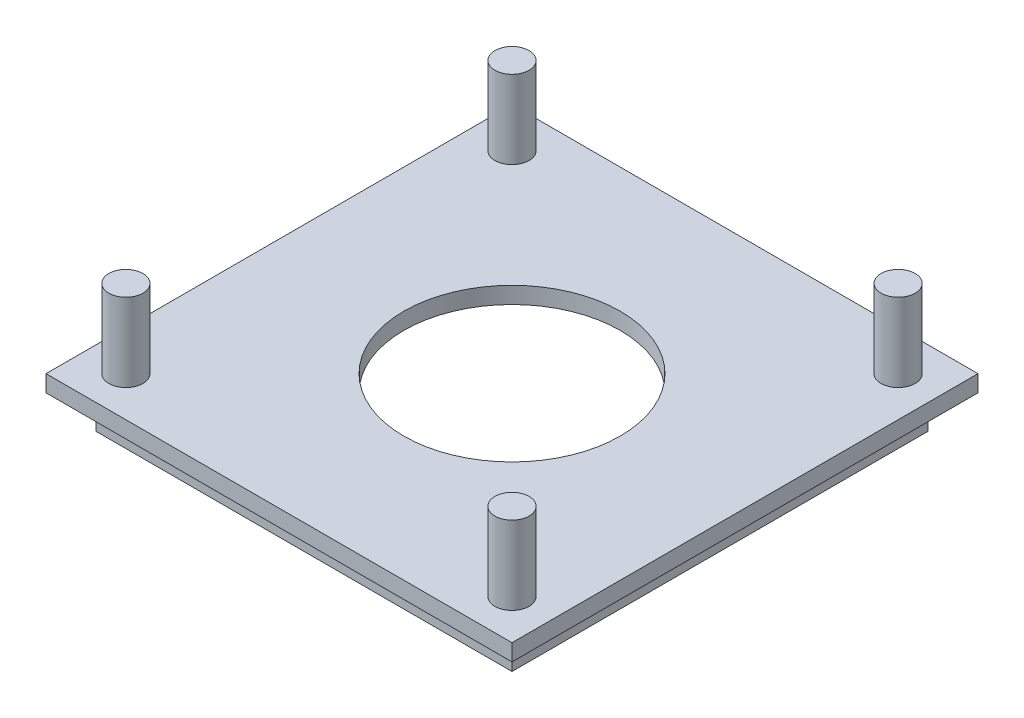
ISO-10303-21;
HEADER;
FILE_DESCRIPTION(('STEP AP214'),'2;1');
FILE_NAME('part.step','',(''),(''),'','','');
FILE_SCHEMA(('AUTOMOTIVE_DESIGN { 1 0 10303 214 1 1 1 1 }'));
ENDSEC;
DATA;
#1=APPLICATION_CONTEXT('core data for automotive mechanical design processes');
#2=APPLICATION_PROTOCOL_DEFINITION('international standard','automotive_design',2000,#1);
#3=PRODUCT_CONTEXT('',#1,'mechanical');
#4=PRODUCT('Part','Part','',(#3));
#5=PRODUCT_RELATED_PRODUCT_CATEGORY('part','',(#4));
#6=PRODUCT_DEFINITION_FORMATION('','',#4);
#7=PRODUCT_DEFINITION_CONTEXT('part definition',#1,'design');
#8=PRODUCT_DEFINITION('design','',#6,#7);
#9=PRODUCT_DEFINITION_SHAPE('','',#8);
#10=(LENGTH_UNIT() NAMED_UNIT(*) SI_UNIT(.MILLI.,.METRE.));
#11=(NAMED_UNIT(*) PLANE_ANGLE_UNIT() SI_UNIT($,.RADIAN.));
#12=(NAMED_UNIT(*) SI_UNIT($,.STERADIAN.) SOLID_ANGLE_UNIT());
#13=UNCERTAINTY_MEASURE_WITH_UNIT(LENGTH_MEASURE(1.E-05),#10,'distance_accuracy_value','');
#14=(GEOMETRIC_REPRESENTATION_CONTEXT(3) GLOBAL_UNCERTAINTY_ASSIGNED_CONTEXT((#13)) GLOBAL_UNIT_ASSIGNED_CONTEXT((#10,
#11,#12)) REPRESENTATION_CONTEXT('',''));
#15=CARTESIAN_POINT('',(0.,0.,0.));
#16=DIRECTION('',(0.,0.,1.));
#17=DIRECTION('',(1.,0.,0.));
#18=AXIS2_PLACEMENT_3D('',#15,#16,#17);
#19=CARTESIAN_POINT('',(0.,0.,0.));
#20=DIRECTION('',(0.,-1.,0.));
#21=DIRECTION('',(0.,0.,-1.));
#22=AXIS2_PLACEMENT_3D('',#19,#20,#21);
#23=PLANE('',#22);
#24=DIRECTION('',(0.,0.,-1.));
#25=VECTOR('',#24,1.);
#26=CARTESIAN_POINT('',(70.,0.,70.));
#27=LINE('',#26,#25);
#28=CARTESIAN_POINT('',(70.,0.,70.));
#29=VERTEX_POINT('',#28);
#30=CARTESIAN_POINT('',(70.,0.,-70.));
#31=VERTEX_POINT('',#30);
#32=EDGE_CURVE('E252',#29,#31,#27,.T.);
#33=ORIENTED_EDGE('',*,*,#32,.F.);
#34=DIRECTION('',(1.,0.,0.));
#35=VECTOR('',#34,1.);
#36=CARTESIAN_POINT('',(-70.,0.,70.));
#37=LINE('',#36,#35);
#38=CARTESIAN_POINT('',(-70.,0.,70.));
#39=VERTEX_POINT('',#38);
#40=EDGE_CURVE('E261',#39,#29,#37,.T.);
#41=ORIENTED_EDGE('',*,*,#40,.F.);
#42=DIRECTION('',(0.,0.,1.));
#43=VECTOR('',#42,1.);
#44=CARTESIAN_POINT('',(-70.,0.,70.));
#45=LINE('',#44,#43);
#46=CARTESIAN_POINT('',(-70.,0.,-70.));
#47=VERTEX_POINT('',#46);
#48=EDGE_CURVE('E277',#47,#39,#45,.T.);
#49=ORIENTED_EDGE('',*,*,#48,.F.);
#50=DIRECTION('',(-1.,0.,0.));
#51=VECTOR('',#50,1.);
#52=CARTESIAN_POINT('',(-70.,0.,-70.));
#53=LINE('',#52,#51);
#54=EDGE_CURVE('E274',#31,#47,#53,.T.);
#55=ORIENTED_EDGE('',*,*,#54,.F.);
#56=EDGE_LOOP('',(#33,#41,#49,#55));
#57=FACE_BOUND('',#56,.T.);
#58=DIRECTION('',(0.,0.,1.));
#59=VECTOR('',#58,1.);
#60=CARTESIAN_POINT('',(62.5,0.,0.));
#61=LINE('',#60,#59);
#62=CARTESIAN_POINT('',(62.5,0.,-62.5));
#63=VERTEX_POINT('',#62);
#64=CARTESIAN_POINT('',(62.5,0.,62.5));
#65=VERTEX_POINT('',#64);
#66=EDGE_CURVE('E71',#63,#65,#61,.T.);
#67=ORIENTED_EDGE('',*,*,#66,.F.);
#68=DIRECTION('',(1.,0.,0.));
#69=VECTOR('',#68,1.);
#70=CARTESIAN_POINT('',(0.,0.,-62.5));
#71=LINE('',#70,#69);
#72=CARTESIAN_POINT('',(-62.5,0.,-62.5));
#73=VERTEX_POINT('',#72);
#74=EDGE_CURVE('E200',#73,#63,#71,.T.);
#75=ORIENTED_EDGE('',*,*,#74,.F.);
#76=DIRECTION('',(0.,0.,1.));
#77=VECTOR('',#76,1.);
#78=CARTESIAN_POINT('',(-62.5,0.,0.));
#79=LINE('',#78,#77);
#80=CARTESIAN_POINT('',(-62.5,0.,62.5));
#81=VERTEX_POINT('',#80);
#82=EDGE_CURVE('E161',#73,#81,#79,.T.);
#83=ORIENTED_EDGE('',*,*,#82,.T.);
#84=DIRECTION('',(1.,0.,0.));
#85=VECTOR('',#84,1.);
#86=CARTESIAN_POINT('',(0.,0.,62.5));
#87=LINE('',#86,#85);
#88=EDGE_CURVE('E206',#81,#65,#87,.T.);
#89=ORIENTED_EDGE('',*,*,#88,.T.);
#90=EDGE_LOOP('',(#67,#75,#83,#89));
#91=FACE_BOUND('',#90,.T.);
#92=ADVANCED_FACE('F47',(#57,#91),#23,.T.);
#93=CARTESIAN_POINT('',(70.,5.,70.));
#94=DIRECTION('',(-1.,0.,0.));
#95=DIRECTION('',(0.,0.,1.));
#96=AXIS2_PLACEMENT_3D('',#93,#94,#95);
#97=PLANE('',#96);
#98=ORIENTED_EDGE('',*,*,#32,.T.);
#99=DIRECTION('',(0.,-1.,0.));
#100=VECTOR('',#99,1.);
#101=CARTESIAN_POINT('',(70.,5.,-70.));
#102=LINE('',#101,#100);
#103=CARTESIAN_POINT('',(70.,5.,-70.));
#104=VERTEX_POINT('',#103);
#105=EDGE_CURVE('E293',#104,#31,#102,.T.);
#106=ORIENTED_EDGE('',*,*,#105,.F.);
#107=DIRECTION('',(0.,0.,-1.));
#108=VECTOR('',#107,1.);
#109=CARTESIAN_POINT('',(70.,5.,70.));
#110=LINE('',#109,#108);
#111=CARTESIAN_POINT('',(70.,5.,70.));
#112=VERTEX_POINT('',#111);
#113=EDGE_CURVE('E256',#112,#104,#110,.T.);
#114=ORIENTED_EDGE('',*,*,#113,.F.);
#115=DIRECTION('',(0.,-1.,0.));
#116=VECTOR('',#115,1.);
#117=CARTESIAN_POINT('',(70.,5.,70.));
#118=LINE('',#117,#116);
#119=EDGE_CURVE('E270',#112,#29,#118,.T.);
#120=ORIENTED_EDGE('',*,*,#119,.T.);
#121=EDGE_LOOP('',(#98,#106,#114,#120));
#122=FACE_BOUND('',#121,.T.);
#123=ADVANCED_FACE('F49',(#122),#97,.F.);
#124=CARTESIAN_POINT('',(-70.,5.,-70.));
#125=DIRECTION('',(0.,0.,1.));
#126=DIRECTION('',(1.,0.,0.));
#127=AXIS2_PLACEMENT_3D('',#124,#125,#126);
#128=PLANE('',#127);
#129=ORIENTED_EDGE('',*,*,#54,.T.);
#130=DIRECTION('',(0.,-1.,0.));
#131=VECTOR('',#130,1.);
#132=CARTESIAN_POINT('',(-70.,5.,-70.));
#133=LINE('',#132,#131);
#134=CARTESIAN_POINT('',(-70.,5.,-70.));
#135=VERTEX_POINT('',#134);
#136=EDGE_CURVE('E289',#135,#47,#133,.T.);
#137=ORIENTED_EDGE('',*,*,#136,.F.);
#138=DIRECTION('',(-1.,0.,0.));
#139=VECTOR('',#138,1.);
#140=CARTESIAN_POINT('',(-70.,5.,-70.));
#141=LINE('',#140,#139);
#142=EDGE_CURVE('E260',#104,#135,#141,.T.);
#143=ORIENTED_EDGE('',*,*,#142,.F.);
#144=ORIENTED_EDGE('',*,*,#105,.T.);
#145=EDGE_LOOP('',(#129,#137,#143,#144));
#146=FACE_BOUND('',#145,.T.);
#147=ADVANCED_FACE('F331',(#146),#128,.F.);
#148=CARTESIAN_POINT('',(-70.,5.,70.));
#149=DIRECTION('',(1.,0.,0.));
#150=DIRECTION('',(0.,0.,-1.));
#151=AXIS2_PLACEMENT_3D('',#148,#149,#150);
#152=PLANE('',#151);
#153=ORIENTED_EDGE('',*,*,#48,.T.);
#154=DIRECTION('',(0.,-1.,0.));
#155=VECTOR('',#154,1.);
#156=CARTESIAN_POINT('',(-70.,5.,70.));
#157=LINE('',#156,#155);
#158=CARTESIAN_POINT('',(-70.,5.,70.));
#159=VERTEX_POINT('',#158);
#160=EDGE_CURVE('E285',#159,#39,#157,.T.);
#161=ORIENTED_EDGE('',*,*,#160,.F.);
#162=DIRECTION('',(0.,0.,1.));
#163=VECTOR('',#162,1.);
#164=CARTESIAN_POINT('',(-70.,5.,70.));
#165=LINE('',#164,#163);
#166=EDGE_CURVE('E264',#135,#159,#165,.T.);
#167=ORIENTED_EDGE('',*,*,#166,.F.);
#168=ORIENTED_EDGE('',*,*,#136,.T.);
#169=EDGE_LOOP('',(#153,#161,#167,#168));
#170=FACE_BOUND('',#169,.T.);
#171=ADVANCED_FACE('F336',(#170),#152,.F.);
#172=CARTESIAN_POINT('',(-70.,5.,70.));
#173=DIRECTION('',(0.,0.,-1.));
#174=DIRECTION('',(-1.,0.,0.));
#175=AXIS2_PLACEMENT_3D('',#172,#173,#174);
#176=PLANE('',#175);
#177=ORIENTED_EDGE('',*,*,#40,.T.);
#178=ORIENTED_EDGE('',*,*,#119,.F.);
#179=DIRECTION('',(1.,0.,0.));
#180=VECTOR('',#179,1.);
#181=CARTESIAN_POINT('',(-70.,5.,70.));
#182=LINE('',#181,#180);
#183=EDGE_CURVE('E267',#159,#112,#182,.T.);
#184=ORIENTED_EDGE('',*,*,#183,.F.);
#185=ORIENTED_EDGE('',*,*,#160,.T.);
#186=EDGE_LOOP('',(#177,#178,#184,#185));
#187=FACE_BOUND('',#186,.T.);
#188=ADVANCED_FACE('F314',(#187),#176,.F.);
#189=CARTESIAN_POINT('',(0.,5.,0.));
#190=DIRECTION('',(0.,-1.,0.));
#191=DIRECTION('',(0.,0.,-1.));
#192=AXIS2_PLACEMENT_3D('',#189,#190,#191);
#193=PLANE('',#192);
#194=CARTESIAN_POINT('',(-58.,5.,58.));
#195=DIRECTION('',(0.,-1.,0.));
#196=DIRECTION('',(0.,0.,-1.));
#197=AXIS2_PLACEMENT_3D('',#194,#195,#196);
#198=CIRCLE('',#197,5.125);
#199=CARTESIAN_POINT('',(-58.,5.,52.875));
#200=VERTEX_POINT('',#199);
#201=EDGE_CURVE('E11',#200,#200,#198,.F.);
#202=ORIENTED_EDGE('',*,*,#201,.F.);
#203=EDGE_LOOP('',(#202));
#204=FACE_BOUND('',#203,.T.);
#205=CARTESIAN_POINT('',(58.,5.,58.));
#206=DIRECTION('',(0.,-1.,0.));
#207=DIRECTION('',(0.,0.,-1.));
#208=AXIS2_PLACEMENT_3D('',#205,#206,#207);
#209=CIRCLE('',#208,5.12499999999999);
#210=CARTESIAN_POINT('',(58.,5.,52.875));
#211=VERTEX_POINT('',#210);
#212=EDGE_CURVE('E56',#211,#211,#209,.F.);
#213=ORIENTED_EDGE('',*,*,#212,.F.);
#214=EDGE_LOOP('',(#213));
#215=FACE_BOUND('',#214,.T.);
#216=CARTESIAN_POINT('',(58.,5.,-58.));
#217=DIRECTION('',(0.,-1.,0.));
#218=DIRECTION('',(0.,0.,-1.));
#219=AXIS2_PLACEMENT_3D('',#216,#217,#218);
#220=CIRCLE('',#219,5.12499999999999);
#221=CARTESIAN_POINT('',(58.,5.,-63.125));
#222=VERTEX_POINT('',#221);
#223=EDGE_CURVE('E301',#222,#222,#220,.F.);
#224=ORIENTED_EDGE('',*,*,#223,.F.);
#225=EDGE_LOOP('',(#224));
#226=FACE_BOUND('',#225,.T.);
#227=CARTESIAN_POINT('',(-58.,5.,-58.));
#228=DIRECTION('',(0.,-1.,0.));
#229=DIRECTION('',(0.,0.,-1.));
#230=AXIS2_PLACEMENT_3D('',#227,#228,#229);
#231=CIRCLE('',#230,5.125);
#232=CARTESIAN_POINT('',(-58.,5.,-63.125));
#233=VERTEX_POINT('',#232);
#234=EDGE_CURVE('E297',#233,#233,#231,.F.);
#235=ORIENTED_EDGE('',*,*,#234,.F.);
#236=EDGE_LOOP('',(#235));
#237=FACE_BOUND('',#236,.T.);
#238=CARTESIAN_POINT('',(0.,5.,0.));
#239=DIRECTION('',(0.,1.,0.));
#240=DIRECTION('',(0.,0.,1.));
#241=AXIS2_PLACEMENT_3D('',#238,#239,#240);
#242=CIRCLE('',#241,32.5);
#243=CARTESIAN_POINT('',(0.,5.,32.5));
#244=VERTEX_POINT('',#243);
#245=EDGE_CURVE('E248',#244,#244,#242,.T.);
#246=ORIENTED_EDGE('',*,*,#245,.F.);
#247=EDGE_LOOP('',(#246));
#248=FACE_BOUND('',#247,.T.);
#249=ORIENTED_EDGE('',*,*,#113,.T.);
#250=ORIENTED_EDGE('',*,*,#142,.T.);
#251=ORIENTED_EDGE('',*,*,#166,.T.);
#252=ORIENTED_EDGE('',*,*,#183,.T.);
#253=EDGE_LOOP('',(#249,#250,#251,#252));
#254=FACE_BOUND('',#253,.T.);
#255=ADVANCED_FACE('F310',(#204,#215,#226,#237,#248,#254),#193,.F.);
#256=DIRECTION('',(0.,0.,1.));
#257=VECTOR('',#256,1.);
#258=CARTESIAN_POINT('',(60.5000000000001,0.,0.));
#259=LINE('',#258,#257);
#260=CARTESIAN_POINT('',(60.5000000000001,0.,-60.5000000000001));
#261=VERTEX_POINT('',#260);
#262=CARTESIAN_POINT('',(60.5000000000001,0.,60.5000000000001));
#263=VERTEX_POINT('',#262);
#264=EDGE_CURVE('E144',#261,#263,#259,.T.);
#265=ORIENTED_EDGE('',*,*,#264,.T.);
#266=DIRECTION('',(1.,0.,0.));
#267=VECTOR('',#266,1.);
#268=CARTESIAN_POINT('',(0.,0.,60.5000000000001));
#269=LINE('',#268,#267);
#270=CARTESIAN_POINT('',(-60.5000000000001,0.,60.5000000000001));
#271=VERTEX_POINT('',#270);
#272=EDGE_CURVE('E197',#271,#263,#269,.T.);
#273=ORIENTED_EDGE('',*,*,#272,.F.);
#274=DIRECTION('',(0.,0.,1.));
#275=VECTOR('',#274,1.);
#276=CARTESIAN_POINT('',(-60.5000000000001,0.,0.));
#277=LINE('',#276,#275);
#278=CARTESIAN_POINT('',(-60.5000000000001,0.,-60.5000000000001));
#279=VERTEX_POINT('',#278);
#280=EDGE_CURVE('E194',#279,#271,#277,.T.);
#281=ORIENTED_EDGE('',*,*,#280,.F.);
#282=DIRECTION('',(1.,0.,0.));
#283=VECTOR('',#282,1.);
#284=CARTESIAN_POINT('',(0.,0.,-60.5000000000001));
#285=LINE('',#284,#283);
#286=EDGE_CURVE('E191',#279,#261,#285,.T.);
#287=ORIENTED_EDGE('',*,*,#286,.T.);
#288=EDGE_LOOP('',(#265,#273,#281,#287));
#289=FACE_BOUND('',#288,.T.);
#290=CARTESIAN_POINT('',(0.,0.,0.));
#291=DIRECTION('',(0.,-1.,0.));
#292=DIRECTION('',(0.,0.,-1.));
#293=AXIS2_PLACEMENT_3D('',#290,#291,#292);
#294=CIRCLE('',#293,32.5);
#295=CARTESIAN_POINT('',(0.,0.,-32.5));
#296=VERTEX_POINT('',#295);
#297=EDGE_CURVE('E247',#296,#296,#294,.F.);
#298=ORIENTED_EDGE('',*,*,#297,.T.);
#299=EDGE_LOOP('',(#298));
#300=FACE_BOUND('',#299,.T.);
#301=ADVANCED_FACE('F313',(#289,#300),#23,.T.);
#302=CARTESIAN_POINT('',(0.,-0.00100000000000013,0.));
#303=DIRECTION('',(0.,1.,0.));
#304=DIRECTION('',(0.,0.,1.));
#305=AXIS2_PLACEMENT_3D('',#302,#303,#304);
#306=CYLINDRICAL_SURFACE('',#305,32.5);
#307=ORIENTED_EDGE('',*,*,#297,.F.);
#308=EDGE_LOOP('',(#307));
#309=FACE_BOUND('',#308,.T.);
#310=ORIENTED_EDGE('',*,*,#245,.T.);
#311=EDGE_LOOP('',(#310));
#312=FACE_BOUND('',#311,.T.);
#313=ADVANCED_FACE('F348',(#309,#312),#306,.F.);
#314=CARTESIAN_POINT('',(-58.,28.5,-58.));
#315=DIRECTION('',(0.,-1.,0.));
#316=DIRECTION('',(0.,0.,-1.));
#317=AXIS2_PLACEMENT_3D('',#314,#315,#316);
#318=CYLINDRICAL_SURFACE('',#317,5.125);
#319=CARTESIAN_POINT('',(-58.,28.5,-58.));
#320=DIRECTION('',(0.,1.,0.));
#321=DIRECTION('',(0.,0.,1.));
#322=AXIS2_PLACEMENT_3D('',#319,#320,#321);
#323=CIRCLE('',#322,5.125);
#324=CARTESIAN_POINT('',(-58.,28.5,-52.875));
#325=VERTEX_POINT('',#324);
#326=EDGE_CURVE('E243',#325,#325,#323,.T.);
#327=ORIENTED_EDGE('',*,*,#326,.F.);
#328=EDGE_LOOP('',(#327));
#329=FACE_BOUND('',#328,.T.);
#330=ORIENTED_EDGE('',*,*,#234,.T.);
#331=EDGE_LOOP('',(#330));
#332=FACE_BOUND('',#331,.T.);
#333=ADVANCED_FACE('F354',(#329,#332),#318,.T.);
#334=CARTESIAN_POINT('',(-58.,28.5,-58.));
#335=DIRECTION('',(0.,1.,0.));
#336=DIRECTION('',(0.,0.,1.));
#337=AXIS2_PLACEMENT_3D('',#334,#335,#336);
#338=PLANE('',#337);
#339=ORIENTED_EDGE('',*,*,#326,.T.);
#340=EDGE_LOOP('',(#339));
#341=FACE_BOUND('',#340,.T.);
#342=ADVANCED_FACE('F402',(#341),#338,.T.);
#343=CARTESIAN_POINT('',(58.,28.5,-58.));
#344=DIRECTION('',(0.,-1.,0.));
#345=DIRECTION('',(0.,0.,-1.));
#346=AXIS2_PLACEMENT_3D('',#343,#344,#345);
#347=CYLINDRICAL_SURFACE('',#346,5.12499999999999);
#348=CARTESIAN_POINT('',(58.,28.5,-58.));
#349=DIRECTION('',(0.,1.,0.));
#350=DIRECTION('',(0.,0.,-1.));
#351=AXIS2_PLACEMENT_3D('',#348,#349,#350);
#352=CIRCLE('',#351,5.12499999999999);
#353=CARTESIAN_POINT('',(58.,28.5,-63.125));
#354=VERTEX_POINT('',#353);
#355=EDGE_CURVE('E239',#354,#354,#352,.T.);
#356=ORIENTED_EDGE('',*,*,#355,.F.);
#357=EDGE_LOOP('',(#356));
#358=FACE_BOUND('',#357,.T.);
#359=ORIENTED_EDGE('',*,*,#223,.T.);
#360=EDGE_LOOP('',(#359));
#361=FACE_BOUND('',#360,.T.);
#362=ADVANCED_FACE('F399',(#358,#361),#347,.T.);
#363=CARTESIAN_POINT('',(58.,28.5,-58.));
#364=DIRECTION('',(0.,-1.,0.));
#365=DIRECTION('',(0.,0.,-1.));
#366=AXIS2_PLACEMENT_3D('',#363,#364,#365);
#367=PLANE('',#366);
#368=ORIENTED_EDGE('',*,*,#355,.T.);
#369=EDGE_LOOP('',(#368));
#370=FACE_BOUND('',#369,.T.);
#371=ADVANCED_FACE('F394',(#370),#367,.F.);
#372=CARTESIAN_POINT('',(58.,28.5,58.));
#373=DIRECTION('',(0.,-1.,0.));
#374=DIRECTION('',(0.,0.,-1.));
#375=AXIS2_PLACEMENT_3D('',#372,#373,#374);
#376=CYLINDRICAL_SURFACE('',#375,5.12499999999999);
#377=CARTESIAN_POINT('',(58.,28.5,58.));
#378=DIRECTION('',(0.,1.,0.));
#379=DIRECTION('',(0.,0.,1.));
#380=AXIS2_PLACEMENT_3D('',#377,#378,#379);
#381=CIRCLE('',#380,5.12499999999999);
#382=CARTESIAN_POINT('',(58.,28.5,63.125));
#383=VERTEX_POINT('',#382);
#384=EDGE_CURVE('E235',#383,#383,#381,.T.);
#385=ORIENTED_EDGE('',*,*,#384,.F.);
#386=EDGE_LOOP('',(#385));
#387=FACE_BOUND('',#386,.T.);
#388=ORIENTED_EDGE('',*,*,#212,.T.);
#389=EDGE_LOOP('',(#388));
#390=FACE_BOUND('',#389,.T.);
#391=ADVANCED_FACE('F308',(#387,#390),#376,.T.);
#392=CARTESIAN_POINT('',(58.,28.5,58.));
#393=DIRECTION('',(0.,1.,0.));
#394=DIRECTION('',(0.,0.,1.));
#395=AXIS2_PLACEMENT_3D('',#392,#393,#394);
#396=PLANE('',#395);
#397=ORIENTED_EDGE('',*,*,#384,.T.);
#398=EDGE_LOOP('',(#397));
#399=FACE_BOUND('',#398,.T.);
#400=ADVANCED_FACE('F388',(#399),#396,.T.);
#401=CARTESIAN_POINT('',(-58.,28.5,58.));
#402=DIRECTION('',(0.,-1.,0.));
#403=DIRECTION('',(0.,0.,-1.));
#404=AXIS2_PLACEMENT_3D('',#401,#402,#403);
#405=CYLINDRICAL_SURFACE('',#404,5.125);
#406=CARTESIAN_POINT('',(-58.,28.5,58.));
#407=DIRECTION('',(0.,1.,0.));
#408=DIRECTION('',(0.,0.,-1.));
#409=AXIS2_PLACEMENT_3D('',#406,#407,#408);
#410=CIRCLE('',#409,5.125);
#411=CARTESIAN_POINT('',(-58.,28.5,52.875));
#412=VERTEX_POINT('',#411);
#413=EDGE_CURVE('E225',#412,#412,#410,.T.);
#414=ORIENTED_EDGE('',*,*,#413,.F.);
#415=EDGE_LOOP('',(#414));
#416=FACE_BOUND('',#415,.T.);
#417=ORIENTED_EDGE('',*,*,#201,.T.);
#418=EDGE_LOOP('',(#417));
#419=FACE_BOUND('',#418,.T.);
#420=ADVANCED_FACE('F384',(#416,#419),#405,.T.);
#421=CARTESIAN_POINT('',(-58.,28.5,58.));
#422=DIRECTION('',(0.,-1.,0.));
#423=DIRECTION('',(0.,0.,-1.));
#424=AXIS2_PLACEMENT_3D('',#421,#422,#423);
#425=PLANE('',#424);
#426=ORIENTED_EDGE('',*,*,#413,.T.);
#427=EDGE_LOOP('',(#426));
#428=FACE_BOUND('',#427,.T.);
#429=ADVANCED_FACE('F387',(#428),#425,.F.);
#430=CARTESIAN_POINT('',(0.,-10.,-62.5));
#431=DIRECTION('',(0.,0.,1.));
#432=DIRECTION('',(1.,0.,0.));
#433=AXIS2_PLACEMENT_3D('',#430,#431,#432);
#434=PLANE('',#433);
#435=ORIENTED_EDGE('',*,*,#74,.T.);
#436=DIRECTION('',(0.,1.,0.));
#437=VECTOR('',#436,1.);
#438=CARTESIAN_POINT('',(62.5,-10.,-62.5));
#439=LINE('',#438,#437);
#440=CARTESIAN_POINT('',(62.5,-10.,-62.5));
#441=VERTEX_POINT('',#440);
#442=EDGE_CURVE('E222',#441,#63,#439,.T.);
#443=ORIENTED_EDGE('',*,*,#442,.F.);
#444=DIRECTION('',(1.,0.,0.));
#445=VECTOR('',#444,1.);
#446=CARTESIAN_POINT('',(0.,-10.,-62.5));
#447=LINE('',#446,#445);
#448=CARTESIAN_POINT('',(-62.5,-10.,-62.5));
#449=VERTEX_POINT('',#448);
#450=EDGE_CURVE('E173',#449,#441,#447,.T.);
#451=ORIENTED_EDGE('',*,*,#450,.F.);
#452=DIRECTION('',(0.,1.,0.));
#453=VECTOR('',#452,1.);
#454=CARTESIAN_POINT('',(-62.5,-10.,-62.5));
#455=LINE('',#454,#453);
#456=EDGE_CURVE('E150',#449,#73,#455,.T.);
#457=ORIENTED_EDGE('',*,*,#456,.T.);
#458=EDGE_LOOP('',(#435,#443,#451,#457));
#459=FACE_BOUND('',#458,.T.);
#460=ADVANCED_FACE('F376',(#459),#434,.F.);
#461=CARTESIAN_POINT('',(62.5,-10.,0.));
#462=DIRECTION('',(-1.,0.,0.));
#463=DIRECTION('',(0.,0.,1.));
#464=AXIS2_PLACEMENT_3D('',#461,#462,#463);
#465=PLANE('',#464);
#466=ORIENTED_EDGE('',*,*,#66,.T.);
#467=DIRECTION('',(0.,1.,0.));
#468=VECTOR('',#467,1.);
#469=CARTESIAN_POINT('',(62.5,-10.,62.5));
#470=LINE('',#469,#468);
#471=CARTESIAN_POINT('',(62.5,-10.,62.5));
#472=VERTEX_POINT('',#471);
#473=EDGE_CURVE('E218',#472,#65,#470,.T.);
#474=ORIENTED_EDGE('',*,*,#473,.F.);
#475=DIRECTION('',(0.,0.,1.));
#476=VECTOR('',#475,1.);
#477=CARTESIAN_POINT('',(62.5,-10.,0.));
#478=LINE('',#477,#476);
#479=EDGE_CURVE('E177',#441,#472,#478,.T.);
#480=ORIENTED_EDGE('',*,*,#479,.F.);
#481=ORIENTED_EDGE('',*,*,#442,.T.);
#482=EDGE_LOOP('',(#466,#474,#480,#481));
#483=FACE_BOUND('',#482,.T.);
#484=ADVANCED_FACE('F467',(#483),#465,.F.);
#485=CARTESIAN_POINT('',(0.,-10.,62.5));
#486=DIRECTION('',(0.,0.,1.));
#487=DIRECTION('',(1.,0.,0.));
#488=AXIS2_PLACEMENT_3D('',#485,#486,#487);
#489=PLANE('',#488);
#490=ORIENTED_EDGE('',*,*,#88,.F.);
#491=DIRECTION('',(0.,1.,0.));
#492=VECTOR('',#491,1.);
#493=CARTESIAN_POINT('',(-62.5,-10.,62.5));
#494=LINE('',#493,#492);
#495=CARTESIAN_POINT('',(-62.5,-10.,62.5));
#496=VERTEX_POINT('',#495);
#497=EDGE_CURVE('E214',#496,#81,#494,.T.);
#498=ORIENTED_EDGE('',*,*,#497,.F.);
#499=DIRECTION('',(1.,0.,0.));
#500=VECTOR('',#499,1.);
#501=CARTESIAN_POINT('',(0.,-10.,62.5));
#502=LINE('',#501,#500);
#503=EDGE_CURVE('E180',#496,#472,#502,.T.);
#504=ORIENTED_EDGE('',*,*,#503,.T.);
#505=ORIENTED_EDGE('',*,*,#473,.T.);
#506=EDGE_LOOP('',(#490,#498,#504,#505));
#507=FACE_BOUND('',#506,.T.);
#508=ADVANCED_FACE('F383',(#507),#489,.T.);
#509=CARTESIAN_POINT('',(60.5000000000001,-10.,0.));
#510=DIRECTION('',(-1.,0.,0.));
#511=DIRECTION('',(0.,0.,1.));
#512=AXIS2_PLACEMENT_3D('',#509,#510,#511);
#513=PLANE('',#512);
#514=ORIENTED_EDGE('',*,*,#264,.F.);
#515=DIRECTION('',(0.,1.,0.));
#516=VECTOR('',#515,1.);
#517=CARTESIAN_POINT('',(60.5000000000001,-10.,-60.5000000000001));
#518=LINE('',#517,#516);
#519=CARTESIAN_POINT('',(60.5000000000001,-10.,-60.5000000000001));
#520=VERTEX_POINT('',#519);
#521=EDGE_CURVE('E139',#520,#261,#518,.T.);
#522=ORIENTED_EDGE('',*,*,#521,.F.);
#523=DIRECTION('',(0.,0.,1.));
#524=VECTOR('',#523,1.);
#525=CARTESIAN_POINT('',(60.5000000000001,-10.,0.));
#526=LINE('',#525,#524);
#527=CARTESIAN_POINT('',(60.5000000000001,-10.,60.5000000000001));
#528=VERTEX_POINT('',#527);
#529=EDGE_CURVE('E142',#520,#528,#526,.T.);
#530=ORIENTED_EDGE('',*,*,#529,.T.);
#531=DIRECTION('',(0.,1.,0.));
#532=VECTOR('',#531,1.);
#533=CARTESIAN_POINT('',(60.5000000000001,-10.,60.5000000000001));
#534=LINE('',#533,#532);
#535=EDGE_CURVE('E188',#528,#263,#534,.T.);
#536=ORIENTED_EDGE('',*,*,#535,.T.);
#537=EDGE_LOOP('',(#514,#522,#530,#536));
#538=FACE_BOUND('',#537,.T.);
#539=ADVANCED_FACE('F141',(#538),#513,.T.);
#540=CARTESIAN_POINT('',(0.,-10.,-60.5000000000001));
#541=DIRECTION('',(0.,0.,1.));
#542=DIRECTION('',(1.,0.,0.));
#543=AXIS2_PLACEMENT_3D('',#540,#541,#542);
#544=PLANE('',#543);
#545=ORIENTED_EDGE('',*,*,#286,.F.);
#546=DIRECTION('',(0.,1.,0.));
#547=VECTOR('',#546,1.);
#548=CARTESIAN_POINT('',(-60.5000000000001,-10.,-60.5000000000001));
#549=LINE('',#548,#547);
#550=CARTESIAN_POINT('',(-60.5000000000001,-10.,-60.5000000000001));
#551=VERTEX_POINT('',#550);
#552=EDGE_CURVE('E151',#551,#279,#549,.T.);
#553=ORIENTED_EDGE('',*,*,#552,.F.);
#554=DIRECTION('',(1.,0.,0.));
#555=VECTOR('',#554,1.);
#556=CARTESIAN_POINT('',(0.,-10.,-60.5000000000001));
#557=LINE('',#556,#555);
#558=EDGE_CURVE('E157',#551,#520,#557,.T.);
#559=ORIENTED_EDGE('',*,*,#558,.T.);
#560=ORIENTED_EDGE('',*,*,#521,.T.);
#561=EDGE_LOOP('',(#545,#553,#559,#560));
#562=FACE_BOUND('',#561,.T.);
#563=ADVANCED_FACE('F163',(#562),#544,.T.);
#564=CARTESIAN_POINT('',(-60.5000000000001,-10.,0.));
#565=DIRECTION('',(-1.,0.,0.));
#566=DIRECTION('',(0.,0.,1.));
#567=AXIS2_PLACEMENT_3D('',#564,#565,#566);
#568=PLANE('',#567);
#569=ORIENTED_EDGE('',*,*,#280,.T.);
#570=DIRECTION('',(0.,1.,0.));
#571=VECTOR('',#570,1.);
#572=CARTESIAN_POINT('',(-60.5000000000001,-10.,60.5000000000001));
#573=LINE('',#572,#571);
#574=CARTESIAN_POINT('',(-60.5000000000001,-10.,60.5000000000001));
#575=VERTEX_POINT('',#574);
#576=EDGE_CURVE('E63',#575,#271,#573,.T.);
#577=ORIENTED_EDGE('',*,*,#576,.F.);
#578=DIRECTION('',(0.,0.,1.));
#579=VECTOR('',#578,1.);
#580=CARTESIAN_POINT('',(-60.5000000000001,-10.,0.));
#581=LINE('',#580,#579);
#582=EDGE_CURVE('E166',#551,#575,#581,.T.);
#583=ORIENTED_EDGE('',*,*,#582,.F.);
#584=ORIENTED_EDGE('',*,*,#552,.T.);
#585=EDGE_LOOP('',(#569,#577,#583,#584));
#586=FACE_BOUND('',#585,.T.);
#587=ADVANCED_FACE('F363',(#586),#568,.F.);
#588=CARTESIAN_POINT('',(0.,-10.,60.5000000000001));
#589=DIRECTION('',(0.,0.,1.));
#590=DIRECTION('',(1.,0.,0.));
#591=AXIS2_PLACEMENT_3D('',#588,#589,#590);
#592=PLANE('',#591);
#593=ORIENTED_EDGE('',*,*,#272,.T.);
#594=ORIENTED_EDGE('',*,*,#535,.F.);
#595=DIRECTION('',(1.,0.,0.));
#596=VECTOR('',#595,1.);
#597=CARTESIAN_POINT('',(0.,-10.,60.5000000000001));
#598=LINE('',#597,#596);
#599=EDGE_CURVE('E158',#575,#528,#598,.T.);
#600=ORIENTED_EDGE('',*,*,#599,.F.);
#601=ORIENTED_EDGE('',*,*,#576,.T.);
#602=EDGE_LOOP('',(#593,#594,#600,#601));
#603=FACE_BOUND('',#602,.T.);
#604=ADVANCED_FACE('F364',(#603),#592,.F.);
#605=CARTESIAN_POINT('',(-62.5,-10.,0.));
#606=DIRECTION('',(-1.,0.,0.));
#607=DIRECTION('',(0.,0.,1.));
#608=AXIS2_PLACEMENT_3D('',#605,#606,#607);
#609=PLANE('',#608);
#610=ORIENTED_EDGE('',*,*,#82,.F.);
#611=ORIENTED_EDGE('',*,*,#456,.F.);
#612=DIRECTION('',(0.,0.,1.));
#613=VECTOR('',#612,1.);
#614=CARTESIAN_POINT('',(-62.5,-10.,0.));
#615=LINE('',#614,#613);
#616=EDGE_CURVE('E184',#449,#496,#615,.T.);
#617=ORIENTED_EDGE('',*,*,#616,.T.);
#618=ORIENTED_EDGE('',*,*,#497,.T.);
#619=EDGE_LOOP('',(#610,#611,#617,#618));
#620=FACE_BOUND('',#619,.T.);
#621=ADVANCED_FACE('F366',(#620),#609,.T.);
#622=CARTESIAN_POINT('',(0.,-10.,0.));
#623=DIRECTION('',(0.,-1.,0.));
#624=DIRECTION('',(0.,0.,-1.));
#625=AXIS2_PLACEMENT_3D('',#622,#623,#624);
#626=PLANE('',#625);
#627=ORIENTED_EDGE('',*,*,#529,.F.);
#628=ORIENTED_EDGE('',*,*,#558,.F.);
#629=ORIENTED_EDGE('',*,*,#582,.T.);
#630=ORIENTED_EDGE('',*,*,#599,.T.);
#631=EDGE_LOOP('',(#627,#628,#629,#630));
#632=FACE_BOUND('',#631,.T.);
#633=ORIENTED_EDGE('',*,*,#450,.T.);
#634=ORIENTED_EDGE('',*,*,#479,.T.);
#635=ORIENTED_EDGE('',*,*,#503,.F.);
#636=ORIENTED_EDGE('',*,*,#616,.F.);
#637=EDGE_LOOP('',(#633,#634,#635,#636));
#638=FACE_BOUND('',#637,.T.);
#639=ADVANCED_FACE('F155',(#632,#638),#626,.T.);
#640=CLOSED_SHELL('',(#92,#123,#147,#171,#188,#255,#301,#313,#333,#342,#362,#371,#391,#400,#420,
#429,#460,#484,#508,#539,#563,#587,#604,#621,#639));
#641=MANIFOLD_SOLID_BREP('B2',#640);
#642=ADVANCED_BREP_SHAPE_REPRESENTATION('',(#18,#641),#14);
#643=SHAPE_DEFINITION_REPRESENTATION(#9,#642);
ENDSEC;
END-ISO-10303-21;
